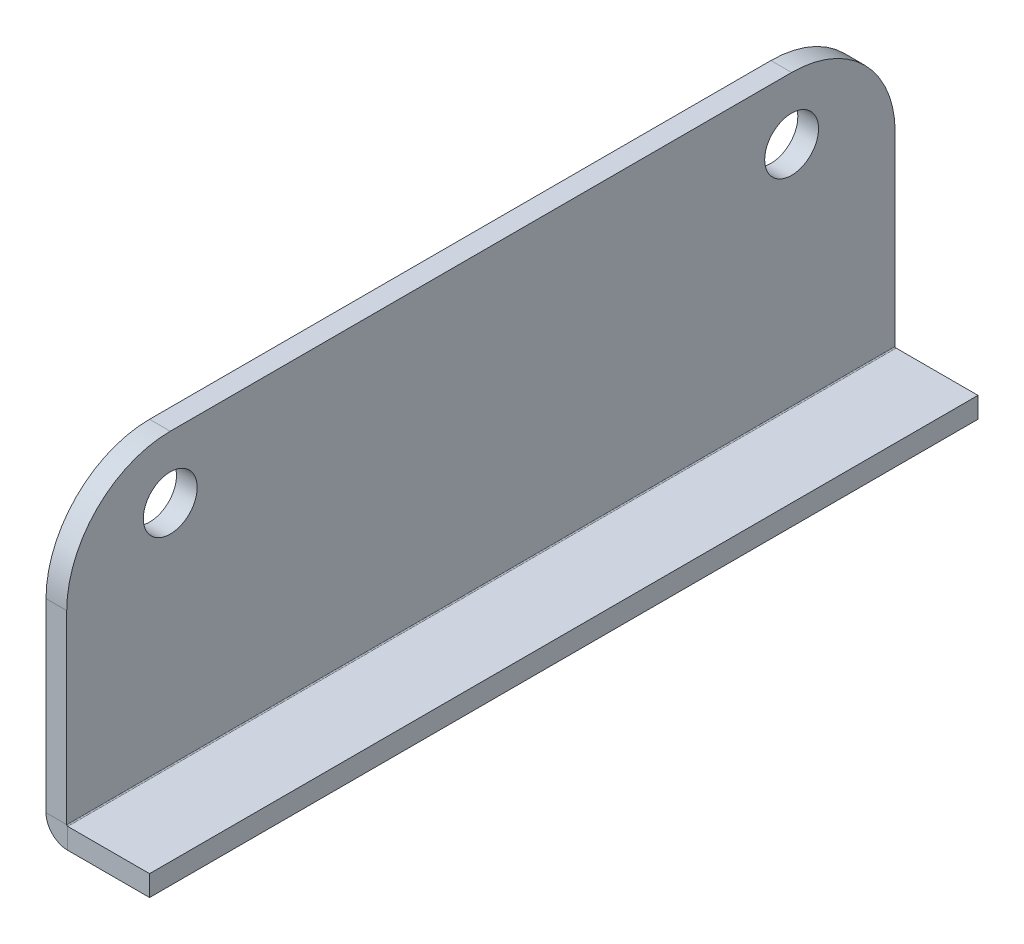
ISO-10303-21;
HEADER;
FILE_DESCRIPTION(('STEP AP214'),'2;1');
FILE_NAME('part.step','',(''),(''),'','','');
FILE_SCHEMA(('AUTOMOTIVE_DESIGN { 1 0 10303 214 1 1 1 1 }'));
ENDSEC;
DATA;
#1=APPLICATION_CONTEXT('core data for automotive mechanical design processes');
#2=APPLICATION_PROTOCOL_DEFINITION('international standard','automotive_design',2000,#1);
#3=PRODUCT_CONTEXT('',#1,'mechanical');
#4=PRODUCT('Part','Part','',(#3));
#5=PRODUCT_RELATED_PRODUCT_CATEGORY('part','',(#4));
#6=PRODUCT_DEFINITION_FORMATION('','',#4);
#7=PRODUCT_DEFINITION_CONTEXT('part definition',#1,'design');
#8=PRODUCT_DEFINITION('design','',#6,#7);
#9=PRODUCT_DEFINITION_SHAPE('','',#8);
#10=(LENGTH_UNIT() NAMED_UNIT(*) SI_UNIT(.MILLI.,.METRE.));
#11=(NAMED_UNIT(*) PLANE_ANGLE_UNIT() SI_UNIT($,.RADIAN.));
#12=(NAMED_UNIT(*) SI_UNIT($,.STERADIAN.) SOLID_ANGLE_UNIT());
#13=UNCERTAINTY_MEASURE_WITH_UNIT(LENGTH_MEASURE(1.E-05),#10,'distance_accuracy_value','');
#14=(GEOMETRIC_REPRESENTATION_CONTEXT(3) GLOBAL_UNCERTAINTY_ASSIGNED_CONTEXT((#13)) GLOBAL_UNIT_ASSIGNED_CONTEXT((#10,
#11,#12)) REPRESENTATION_CONTEXT('',''));
#15=CARTESIAN_POINT('',(0.,0.,0.));
#16=DIRECTION('',(0.,0.,1.));
#17=DIRECTION('',(1.,0.,0.));
#18=AXIS2_PLACEMENT_3D('',#15,#16,#17);
#19=CARTESIAN_POINT('',(10.,160.778232357493,80.));
#20=DIRECTION('',(-1.,0.,0.));
#21=DIRECTION('',(0.,-1.,0.));
#22=AXIS2_PLACEMENT_3D('',#19,#20,#21);
#23=PLANE('',#22);
#24=DIRECTION('',(0.,-1.,0.));
#25=VECTOR('',#24,1.);
#26=CARTESIAN_POINT('',(10.,160.778232357493,80.));
#27=LINE('',#26,#25);
#28=CARTESIAN_POINT('',(10.,2.,80.));
#29=VERTEX_POINT('',#28);
#30=CARTESIAN_POINT('',(10.,0.,80.));
#31=VERTEX_POINT('',#30);
#32=EDGE_CURVE('E208',#29,#31,#27,.T.);
#33=ORIENTED_EDGE('',*,*,#32,.T.);
#34=DIRECTION('',(0.,0.,-1.));
#35=VECTOR('',#34,1.);
#36=CARTESIAN_POINT('',(10.,0.,80.));
#37=LINE('',#36,#35);
#38=CARTESIAN_POINT('',(10.,0.,0.));
#39=VERTEX_POINT('',#38);
#40=EDGE_CURVE('E196',#31,#39,#37,.T.);
#41=ORIENTED_EDGE('',*,*,#40,.T.);
#42=DIRECTION('',(0.,-1.,0.));
#43=VECTOR('',#42,1.);
#44=CARTESIAN_POINT('',(10.,160.778232357493,0.));
#45=LINE('',#44,#43);
#46=CARTESIAN_POINT('',(10.,2.,0.));
#47=VERTEX_POINT('',#46);
#48=EDGE_CURVE('E103',#47,#39,#45,.T.);
#49=ORIENTED_EDGE('',*,*,#48,.F.);
#50=DIRECTION('',(0.,0.,-1.));
#51=VECTOR('',#50,1.);
#52=CARTESIAN_POINT('',(10.,2.,80.));
#53=LINE('',#52,#51);
#54=EDGE_CURVE('E12',#29,#47,#53,.T.);
#55=ORIENTED_EDGE('',*,*,#54,.F.);
#56=EDGE_LOOP('',(#33,#41,#49,#55));
#57=FACE_BOUND('',#56,.T.);
#58=ADVANCED_FACE('F53',(#57),#23,.F.);
#59=CARTESIAN_POINT('',(0.,160.778232357493,80.));
#60=DIRECTION('',(0.,0.,-1.));
#61=DIRECTION('',(0.,-1.,0.));
#62=AXIS2_PLACEMENT_3D('',#59,#60,#61);
#63=PLANE('',#62);
#64=DIRECTION('',(0.,-1.,0.));
#65=VECTOR('',#64,1.);
#66=CARTESIAN_POINT('',(2.1,160.778232357493,80.));
#67=LINE('',#66,#65);
#68=CARTESIAN_POINT('',(2.1,2.,80.));
#69=VERTEX_POINT('',#68);
#70=CARTESIAN_POINT('',(2.1,0.,80.));
#71=VERTEX_POINT('',#70);
#72=EDGE_CURVE('E185',#69,#71,#67,.T.);
#73=ORIENTED_EDGE('',*,*,#72,.T.);
#74=DIRECTION('',(1.,0.,0.));
#75=VECTOR('',#74,1.);
#76=CARTESIAN_POINT('',(0.,0.,80.));
#77=LINE('',#76,#75);
#78=EDGE_CURVE('E193',#71,#31,#77,.T.);
#79=ORIENTED_EDGE('',*,*,#78,.T.);
#80=ORIENTED_EDGE('',*,*,#32,.F.);
#81=DIRECTION('',(1.,0.,0.));
#82=VECTOR('',#81,1.);
#83=CARTESIAN_POINT('',(0.,2.,80.));
#84=LINE('',#83,#82);
#85=EDGE_CURVE('E66',#69,#29,#84,.T.);
#86=ORIENTED_EDGE('',*,*,#85,.F.);
#87=EDGE_LOOP('',(#73,#79,#80,#86));
#88=FACE_BOUND('',#87,.T.);
#89=ADVANCED_FACE('F201',(#88),#63,.F.);
#90=CARTESIAN_POINT('',(0.,0.,80.));
#91=DIRECTION('',(0.,1.,0.));
#92=DIRECTION('',(0.,0.,1.));
#93=AXIS2_PLACEMENT_3D('',#90,#91,#92);
#94=PLANE('',#93);
#95=DIRECTION('',(1.,0.,0.));
#96=VECTOR('',#95,1.);
#97=CARTESIAN_POINT('',(0.,0.,0.));
#98=LINE('',#97,#96);
#99=CARTESIAN_POINT('',(2.1,0.,0.));
#100=VERTEX_POINT('',#99);
#101=EDGE_CURVE('E180',#100,#39,#98,.T.);
#102=ORIENTED_EDGE('',*,*,#101,.T.);
#103=ORIENTED_EDGE('',*,*,#40,.F.);
#104=ORIENTED_EDGE('',*,*,#78,.F.);
#105=DIRECTION('',(0.,0.,-1.));
#106=VECTOR('',#105,1.);
#107=CARTESIAN_POINT('',(2.1,0.,80.));
#108=LINE('',#107,#106);
#109=EDGE_CURVE('E171',#71,#100,#108,.T.);
#110=ORIENTED_EDGE('',*,*,#109,.T.);
#111=EDGE_LOOP('',(#102,#103,#104,#110));
#112=FACE_BOUND('',#111,.T.);
#113=ADVANCED_FACE('F195',(#112),#94,.F.);
#114=CARTESIAN_POINT('',(0.,160.778232357493,0.));
#115=DIRECTION('',(0.,0.,-1.));
#116=DIRECTION('',(0.,-1.,0.));
#117=AXIS2_PLACEMENT_3D('',#114,#115,#116);
#118=PLANE('',#117);
#119=ORIENTED_EDGE('',*,*,#101,.F.);
#120=DIRECTION('',(0.,-1.,0.));
#121=VECTOR('',#120,1.);
#122=CARTESIAN_POINT('',(2.1,160.778232357493,0.));
#123=LINE('',#122,#121);
#124=CARTESIAN_POINT('',(2.1,2.,0.));
#125=VERTEX_POINT('',#124);
#126=EDGE_CURVE('E346',#125,#100,#123,.T.);
#127=ORIENTED_EDGE('',*,*,#126,.F.);
#128=DIRECTION('',(1.,0.,0.));
#129=VECTOR('',#128,1.);
#130=CARTESIAN_POINT('',(0.,2.,0.));
#131=LINE('',#130,#129);
#132=EDGE_CURVE('E179',#125,#47,#131,.T.);
#133=ORIENTED_EDGE('',*,*,#132,.T.);
#134=ORIENTED_EDGE('',*,*,#48,.T.);
#135=EDGE_LOOP('',(#119,#127,#133,#134));
#136=FACE_BOUND('',#135,.T.);
#137=ADVANCED_FACE('F343',(#136),#118,.T.);
#138=CARTESIAN_POINT('',(0.,2.,80.));
#139=DIRECTION('',(0.,1.,0.));
#140=DIRECTION('',(0.,0.,1.));
#141=AXIS2_PLACEMENT_3D('',#138,#139,#140);
#142=PLANE('',#141);
#143=ORIENTED_EDGE('',*,*,#132,.F.);
#144=DIRECTION('',(0.,0.,-1.));
#145=VECTOR('',#144,1.);
#146=CARTESIAN_POINT('',(2.1,2.,80.));
#147=LINE('',#146,#145);
#148=EDGE_CURVE('E58',#69,#125,#147,.T.);
#149=ORIENTED_EDGE('',*,*,#148,.F.);
#150=ORIENTED_EDGE('',*,*,#85,.T.);
#151=ORIENTED_EDGE('',*,*,#54,.T.);
#152=EDGE_LOOP('',(#143,#149,#150,#151));
#153=FACE_BOUND('',#152,.T.);
#154=ADVANCED_FACE('F56',(#153),#142,.T.);
#155=CARTESIAN_POINT('',(10.,24.,70.));
#156=DIRECTION('',(-1.,0.,0.));
#157=DIRECTION('',(0.,-1.,0.));
#158=AXIS2_PLACEMENT_3D('',#155,#156,#157);
#159=CYLINDRICAL_SURFACE('',#158,2.59999999999999);
#160=CARTESIAN_POINT('',(2.,24.,70.));
#161=DIRECTION('',(1.,0.,0.));
#162=DIRECTION('',(0.,1.,0.));
#163=AXIS2_PLACEMENT_3D('',#160,#161,#162);
#164=CIRCLE('',#163,2.59999999999999);
#165=CARTESIAN_POINT('',(2.,26.6,70.));
#166=VERTEX_POINT('',#165);
#167=EDGE_CURVE('E247',#166,#166,#164,.T.);
#168=ORIENTED_EDGE('',*,*,#167,.T.);
#169=EDGE_LOOP('',(#168));
#170=FACE_BOUND('',#169,.T.);
#171=CARTESIAN_POINT('',(0.,24.,70.));
#172=DIRECTION('',(-1.,0.,0.));
#173=DIRECTION('',(0.,1.,0.));
#174=AXIS2_PLACEMENT_3D('',#171,#172,#173);
#175=CIRCLE('',#174,2.59999999999999);
#176=CARTESIAN_POINT('',(0.,26.6,70.));
#177=VERTEX_POINT('',#176);
#178=EDGE_CURVE('E292',#177,#177,#175,.T.);
#179=ORIENTED_EDGE('',*,*,#178,.T.);
#180=EDGE_LOOP('',(#179));
#181=FACE_BOUND('',#180,.T.);
#182=ADVANCED_FACE('F348',(#170,#181),#159,.F.);
#183=CARTESIAN_POINT('',(0.,30.,80.));
#184=DIRECTION('',(1.,0.,0.));
#185=DIRECTION('',(0.,1.,0.));
#186=AXIS2_PLACEMENT_3D('',#183,#184,#185);
#187=PLANE('',#186);
#188=CARTESIAN_POINT('',(0.,24.,10.));
#189=DIRECTION('',(-1.,0.,0.));
#190=DIRECTION('',(0.,-1.,0.));
#191=AXIS2_PLACEMENT_3D('',#188,#189,#190);
#192=CIRCLE('',#191,2.6);
#193=CARTESIAN_POINT('',(0.,21.4,10.));
#194=VERTEX_POINT('',#193);
#195=EDGE_CURVE('E288',#194,#194,#192,.T.);
#196=ORIENTED_EDGE('',*,*,#195,.F.);
#197=EDGE_LOOP('',(#196));
#198=FACE_BOUND('',#197,.T.);
#199=ORIENTED_EDGE('',*,*,#178,.F.);
#200=EDGE_LOOP('',(#199));
#201=FACE_BOUND('',#200,.T.);
#202=DIRECTION('',(0.,0.,-1.));
#203=VECTOR('',#202,1.);
#204=CARTESIAN_POINT('',(0.,30.,80.));
#205=LINE('',#204,#203);
#206=CARTESIAN_POINT('',(0.,30.,70.));
#207=VERTEX_POINT('',#206);
#208=CARTESIAN_POINT('',(0.,30.,9.99999999999999));
#209=VERTEX_POINT('',#208);
#210=EDGE_CURVE('E296',#207,#209,#205,.T.);
#211=ORIENTED_EDGE('',*,*,#210,.T.);
#212=CARTESIAN_POINT('',(0.,20.,10.));
#213=DIRECTION('',(1.,0.,0.));
#214=DIRECTION('',(0.,1.,0.));
#215=AXIS2_PLACEMENT_3D('',#212,#213,#214);
#216=CIRCLE('',#215,10.);
#217=CARTESIAN_POINT('',(0.,20.,0.));
#218=VERTEX_POINT('',#217);
#219=EDGE_CURVE('E300',#209,#218,#216,.F.);
#220=ORIENTED_EDGE('',*,*,#219,.T.);
#221=DIRECTION('',(0.,-1.,0.));
#222=VECTOR('',#221,1.);
#223=CARTESIAN_POINT('',(0.,30.,0.));
#224=LINE('',#223,#222);
#225=CARTESIAN_POINT('',(0.,2.1,0.));
#226=VERTEX_POINT('',#225);
#227=EDGE_CURVE('E302',#218,#226,#224,.T.);
#228=ORIENTED_EDGE('',*,*,#227,.T.);
#229=DIRECTION('',(0.,0.,-1.));
#230=VECTOR('',#229,1.);
#231=CARTESIAN_POINT('',(0.,2.1,80.));
#232=LINE('',#231,#230);
#233=CARTESIAN_POINT('',(0.,2.1,80.));
#234=VERTEX_POINT('',#233);
#235=EDGE_CURVE('E306',#234,#226,#232,.T.);
#236=ORIENTED_EDGE('',*,*,#235,.F.);
#237=DIRECTION('',(0.,-1.,0.));
#238=VECTOR('',#237,1.);
#239=CARTESIAN_POINT('',(0.,30.,80.));
#240=LINE('',#239,#238);
#241=CARTESIAN_POINT('',(0.,20.,80.));
#242=VERTEX_POINT('',#241);
#243=EDGE_CURVE('E309',#242,#234,#240,.T.);
#244=ORIENTED_EDGE('',*,*,#243,.F.);
#245=CARTESIAN_POINT('',(0.,20.,70.));
#246=DIRECTION('',(1.,0.,0.));
#247=DIRECTION('',(0.,1.,0.));
#248=AXIS2_PLACEMENT_3D('',#245,#246,#247);
#249=CIRCLE('',#248,10.);
#250=EDGE_CURVE('E314',#242,#207,#249,.F.);
#251=ORIENTED_EDGE('',*,*,#250,.T.);
#252=EDGE_LOOP('',(#211,#220,#228,#236,#244,#251));
#253=FACE_BOUND('',#252,.T.);
#254=ADVANCED_FACE('F353',(#198,#201,#253),#187,.F.);
#255=CARTESIAN_POINT('',(10.,24.,10.));
#256=DIRECTION('',(-1.,0.,0.));
#257=DIRECTION('',(0.,-1.,0.));
#258=AXIS2_PLACEMENT_3D('',#255,#256,#257);
#259=CYLINDRICAL_SURFACE('',#258,2.6);
#260=CARTESIAN_POINT('',(2.,24.,10.));
#261=DIRECTION('',(1.,0.,0.));
#262=DIRECTION('',(0.,1.,0.));
#263=AXIS2_PLACEMENT_3D('',#260,#261,#262);
#264=CIRCLE('',#263,2.6);
#265=CARTESIAN_POINT('',(2.,26.6,10.));
#266=VERTEX_POINT('',#265);
#267=EDGE_CURVE('E242',#266,#266,#264,.T.);
#268=ORIENTED_EDGE('',*,*,#267,.T.);
#269=EDGE_LOOP('',(#268));
#270=FACE_BOUND('',#269,.T.);
#271=ORIENTED_EDGE('',*,*,#195,.T.);
#272=EDGE_LOOP('',(#271));
#273=FACE_BOUND('',#272,.T.);
#274=ADVANCED_FACE('F404',(#270,#273),#259,.F.);
#275=CARTESIAN_POINT('',(2.,30.,80.));
#276=DIRECTION('',(1.,0.,0.));
#277=DIRECTION('',(0.,1.,0.));
#278=AXIS2_PLACEMENT_3D('',#275,#276,#277);
#279=PLANE('',#278);
#280=ORIENTED_EDGE('',*,*,#267,.F.);
#281=EDGE_LOOP('',(#280));
#282=FACE_BOUND('',#281,.T.);
#283=ORIENTED_EDGE('',*,*,#167,.F.);
#284=EDGE_LOOP('',(#283));
#285=FACE_BOUND('',#284,.T.);
#286=DIRECTION('',(0.,-1.,0.));
#287=VECTOR('',#286,1.);
#288=CARTESIAN_POINT('',(2.,30.,0.));
#289=LINE('',#288,#287);
#290=CARTESIAN_POINT('',(2.,20.,0.));
#291=VERTEX_POINT('',#290);
#292=CARTESIAN_POINT('',(2.,2.1,0.));
#293=VERTEX_POINT('',#292);
#294=EDGE_CURVE('E259',#291,#293,#289,.T.);
#295=ORIENTED_EDGE('',*,*,#294,.F.);
#296=CARTESIAN_POINT('',(2.,20.,10.));
#297=DIRECTION('',(1.,0.,0.));
#298=DIRECTION('',(0.,1.,0.));
#299=AXIS2_PLACEMENT_3D('',#296,#297,#298);
#300=CIRCLE('',#299,10.);
#301=CARTESIAN_POINT('',(2.,30.,9.99999999999999));
#302=VERTEX_POINT('',#301);
#303=EDGE_CURVE('E113',#291,#302,#300,.T.);
#304=ORIENTED_EDGE('',*,*,#303,.T.);
#305=DIRECTION('',(0.,0.,-1.));
#306=VECTOR('',#305,1.);
#307=CARTESIAN_POINT('',(2.,30.,80.));
#308=LINE('',#307,#306);
#309=CARTESIAN_POINT('',(2.,30.,70.));
#310=VERTEX_POINT('',#309);
#311=EDGE_CURVE('E124',#310,#302,#308,.T.);
#312=ORIENTED_EDGE('',*,*,#311,.F.);
#313=CARTESIAN_POINT('',(2.,20.,70.));
#314=DIRECTION('',(1.,0.,0.));
#315=DIRECTION('',(0.,1.,0.));
#316=AXIS2_PLACEMENT_3D('',#313,#314,#315);
#317=CIRCLE('',#316,10.);
#318=CARTESIAN_POINT('',(2.,20.,80.));
#319=VERTEX_POINT('',#318);
#320=EDGE_CURVE('E274',#310,#319,#317,.T.);
#321=ORIENTED_EDGE('',*,*,#320,.T.);
#322=DIRECTION('',(0.,-1.,0.));
#323=VECTOR('',#322,1.);
#324=CARTESIAN_POINT('',(2.,30.,80.));
#325=LINE('',#324,#323);
#326=CARTESIAN_POINT('',(2.,2.1,80.));
#327=VERTEX_POINT('',#326);
#328=EDGE_CURVE('E278',#319,#327,#325,.T.);
#329=ORIENTED_EDGE('',*,*,#328,.T.);
#330=DIRECTION('',(0.,0.,-1.));
#331=VECTOR('',#330,1.);
#332=CARTESIAN_POINT('',(2.,2.1,80.));
#333=LINE('',#332,#331);
#334=EDGE_CURVE('E283',#327,#293,#333,.T.);
#335=ORIENTED_EDGE('',*,*,#334,.T.);
#336=EDGE_LOOP('',(#295,#304,#312,#321,#329,#335));
#337=FACE_BOUND('',#336,.T.);
#338=ADVANCED_FACE('F414',(#282,#285,#337),#279,.T.);
#339=CARTESIAN_POINT('',(169.450995866062,30.,0.));
#340=DIRECTION('',(0.,0.,-1.));
#341=DIRECTION('',(-1.,0.,0.));
#342=AXIS2_PLACEMENT_3D('',#339,#340,#341);
#343=PLANE('',#342);
#344=ORIENTED_EDGE('',*,*,#227,.F.);
#345=DIRECTION('',(-1.,0.,0.));
#346=VECTOR('',#345,1.);
#347=CARTESIAN_POINT('',(169.450995866062,20.,0.));
#348=LINE('',#347,#346);
#349=EDGE_CURVE('E334',#291,#218,#348,.T.);
#350=ORIENTED_EDGE('',*,*,#349,.F.);
#351=ORIENTED_EDGE('',*,*,#294,.T.);
#352=DIRECTION('',(-1.,0.,0.));
#353=VECTOR('',#352,1.);
#354=CARTESIAN_POINT('',(169.450995866062,2.1,0.));
#355=LINE('',#354,#353);
#356=EDGE_CURVE('E317',#293,#226,#355,.T.);
#357=ORIENTED_EDGE('',*,*,#356,.T.);
#358=EDGE_LOOP('',(#344,#350,#351,#357));
#359=FACE_BOUND('',#358,.T.);
#360=ADVANCED_FACE('F363',(#359),#343,.T.);
#361=CARTESIAN_POINT('',(169.450995866062,20.,10.));
#362=DIRECTION('',(-1.,0.,0.));
#363=DIRECTION('',(0.,-1.,0.));
#364=AXIS2_PLACEMENT_3D('',#361,#362,#363);
#365=CYLINDRICAL_SURFACE('',#364,10.);
#366=ORIENTED_EDGE('',*,*,#349,.T.);
#367=ORIENTED_EDGE('',*,*,#219,.F.);
#368=DIRECTION('',(-1.,0.,0.));
#369=VECTOR('',#368,1.);
#370=CARTESIAN_POINT('',(169.450995866062,30.,9.99999999999999));
#371=LINE('',#370,#369);
#372=EDGE_CURVE('E331',#302,#209,#371,.T.);
#373=ORIENTED_EDGE('',*,*,#372,.F.);
#374=ORIENTED_EDGE('',*,*,#303,.F.);
#375=EDGE_LOOP('',(#366,#367,#373,#374));
#376=FACE_BOUND('',#375,.T.);
#377=ADVANCED_FACE('F433',(#376),#365,.T.);
#378=CARTESIAN_POINT('',(169.450995866062,30.,80.));
#379=DIRECTION('',(0.,1.,0.));
#380=DIRECTION('',(-1.,0.,0.));
#381=AXIS2_PLACEMENT_3D('',#378,#379,#380);
#382=PLANE('',#381);
#383=ORIENTED_EDGE('',*,*,#210,.F.);
#384=DIRECTION('',(-1.,0.,0.));
#385=VECTOR('',#384,1.);
#386=CARTESIAN_POINT('',(169.450995866062,30.,70.));
#387=LINE('',#386,#385);
#388=EDGE_CURVE('E327',#310,#207,#387,.T.);
#389=ORIENTED_EDGE('',*,*,#388,.F.);
#390=ORIENTED_EDGE('',*,*,#311,.T.);
#391=ORIENTED_EDGE('',*,*,#372,.T.);
#392=EDGE_LOOP('',(#383,#389,#390,#391));
#393=FACE_BOUND('',#392,.T.);
#394=ADVANCED_FACE('F442',(#393),#382,.T.);
#395=CARTESIAN_POINT('',(169.450995866062,20.,70.));
#396=DIRECTION('',(-1.,0.,0.));
#397=DIRECTION('',(0.,-1.,0.));
#398=AXIS2_PLACEMENT_3D('',#395,#396,#397);
#399=CYLINDRICAL_SURFACE('',#398,10.);
#400=ORIENTED_EDGE('',*,*,#388,.T.);
#401=ORIENTED_EDGE('',*,*,#250,.F.);
#402=DIRECTION('',(-1.,0.,0.));
#403=VECTOR('',#402,1.);
#404=CARTESIAN_POINT('',(169.450995866062,20.,80.));
#405=LINE('',#404,#403);
#406=EDGE_CURVE('E323',#319,#242,#405,.T.);
#407=ORIENTED_EDGE('',*,*,#406,.F.);
#408=ORIENTED_EDGE('',*,*,#320,.F.);
#409=EDGE_LOOP('',(#400,#401,#407,#408));
#410=FACE_BOUND('',#409,.T.);
#411=ADVANCED_FACE('F450',(#410),#399,.T.);
#412=CARTESIAN_POINT('',(169.450995866062,30.,80.));
#413=DIRECTION('',(0.,0.,-1.));
#414=DIRECTION('',(-1.,0.,0.));
#415=AXIS2_PLACEMENT_3D('',#412,#413,#414);
#416=PLANE('',#415);
#417=ORIENTED_EDGE('',*,*,#406,.T.);
#418=ORIENTED_EDGE('',*,*,#243,.T.);
#419=DIRECTION('',(-1.,0.,0.));
#420=VECTOR('',#419,1.);
#421=CARTESIAN_POINT('',(169.450995866062,2.1,80.));
#422=LINE('',#421,#420);
#423=EDGE_CURVE('E188',#327,#234,#422,.T.);
#424=ORIENTED_EDGE('',*,*,#423,.F.);
#425=ORIENTED_EDGE('',*,*,#328,.F.);
#426=EDGE_LOOP('',(#417,#418,#424,#425));
#427=FACE_BOUND('',#426,.T.);
#428=ADVANCED_FACE('F459',(#427),#416,.F.);
#429=CARTESIAN_POINT('',(2.1,2.1,0.));
#430=DIRECTION('',(0.,0.,-1.));
#431=DIRECTION('',(-1.,0.,0.));
#432=AXIS2_PLACEMENT_3D('',#429,#430,#431);
#433=PLANE('',#432);
#434=ORIENTED_EDGE('',*,*,#356,.F.);
#435=CARTESIAN_POINT('',(2.1,2.1,0.));
#436=DIRECTION('',(0.,0.,-1.));
#437=DIRECTION('',(-1.,0.,0.));
#438=AXIS2_PLACEMENT_3D('',#435,#436,#437);
#439=CIRCLE('',#438,0.0999999999999999);
#440=EDGE_CURVE('E190',#293,#125,#439,.F.);
#441=ORIENTED_EDGE('',*,*,#440,.T.);
#442=ORIENTED_EDGE('',*,*,#126,.T.);
#443=CARTESIAN_POINT('',(2.1,2.1,0.));
#444=DIRECTION('',(0.,0.,-1.));
#445=DIRECTION('',(-1.,0.,0.));
#446=AXIS2_PLACEMENT_3D('',#443,#444,#445);
#447=CIRCLE('',#446,2.1);
#448=EDGE_CURVE('E78',#226,#100,#447,.F.);
#449=ORIENTED_EDGE('',*,*,#448,.F.);
#450=EDGE_LOOP('',(#434,#441,#442,#449));
#451=FACE_BOUND('',#450,.T.);
#452=ADVANCED_FACE('F469',(#451),#433,.T.);
#453=CARTESIAN_POINT('',(2.1,2.1,80.));
#454=DIRECTION('',(0.,0.,1.));
#455=DIRECTION('',(1.,0.,0.));
#456=AXIS2_PLACEMENT_3D('',#453,#454,#455);
#457=PLANE('',#456);
#458=ORIENTED_EDGE('',*,*,#72,.F.);
#459=CARTESIAN_POINT('',(2.1,2.1,80.));
#460=DIRECTION('',(0.,0.,-1.));
#461=DIRECTION('',(-1.,0.,0.));
#462=AXIS2_PLACEMENT_3D('',#459,#460,#461);
#463=CIRCLE('',#462,0.0999999999999999);
#464=EDGE_CURVE('E234',#69,#327,#463,.T.);
#465=ORIENTED_EDGE('',*,*,#464,.T.);
#466=ORIENTED_EDGE('',*,*,#423,.T.);
#467=CARTESIAN_POINT('',(2.1,2.1,80.));
#468=DIRECTION('',(0.,0.,-1.));
#469=DIRECTION('',(-1.,0.,0.));
#470=AXIS2_PLACEMENT_3D('',#467,#468,#469);
#471=CIRCLE('',#470,2.1);
#472=EDGE_CURVE('E174',#71,#234,#471,.T.);
#473=ORIENTED_EDGE('',*,*,#472,.F.);
#474=EDGE_LOOP('',(#458,#465,#466,#473));
#475=FACE_BOUND('',#474,.T.);
#476=ADVANCED_FACE('F183',(#475),#457,.T.);
#477=CARTESIAN_POINT('',(2.1,2.1,167.997499964488));
#478=DIRECTION('',(0.,0.,-1.));
#479=DIRECTION('',(-1.,0.,0.));
#480=AXIS2_PLACEMENT_3D('',#477,#478,#479);
#481=CYLINDRICAL_SURFACE('',#480,2.1);
#482=ORIENTED_EDGE('',*,*,#472,.T.);
#483=ORIENTED_EDGE('',*,*,#235,.T.);
#484=ORIENTED_EDGE('',*,*,#448,.T.);
#485=ORIENTED_EDGE('',*,*,#109,.F.);
#486=EDGE_LOOP('',(#482,#483,#484,#485));
#487=FACE_BOUND('',#486,.T.);
#488=ADVANCED_FACE('F173',(#487),#481,.T.);
#489=CARTESIAN_POINT('',(2.1,2.1,167.997499964488));
#490=DIRECTION('',(0.,0.,-1.));
#491=DIRECTION('',(-1.,0.,0.));
#492=AXIS2_PLACEMENT_3D('',#489,#490,#491);
#493=CYLINDRICAL_SURFACE('',#492,0.0999999999999999);
#494=ORIENTED_EDGE('',*,*,#464,.F.);
#495=ORIENTED_EDGE('',*,*,#148,.T.);
#496=ORIENTED_EDGE('',*,*,#440,.F.);
#497=ORIENTED_EDGE('',*,*,#334,.F.);
#498=EDGE_LOOP('',(#494,#495,#496,#497));
#499=FACE_BOUND('',#498,.T.);
#500=ADVANCED_FACE('F494',(#499),#493,.F.);
#501=CLOSED_SHELL('',(#58,#89,#113,#137,#154,#182,#254,#274,#338,#360,#377,#394,#411,#428,#452,
#476,#488,#500));
#502=MANIFOLD_SOLID_BREP('B2',#501);
#503=ADVANCED_BREP_SHAPE_REPRESENTATION('',(#18,#502),#14);
#504=SHAPE_DEFINITION_REPRESENTATION(#9,#503);
ENDSEC;
END-ISO-10303-21;
